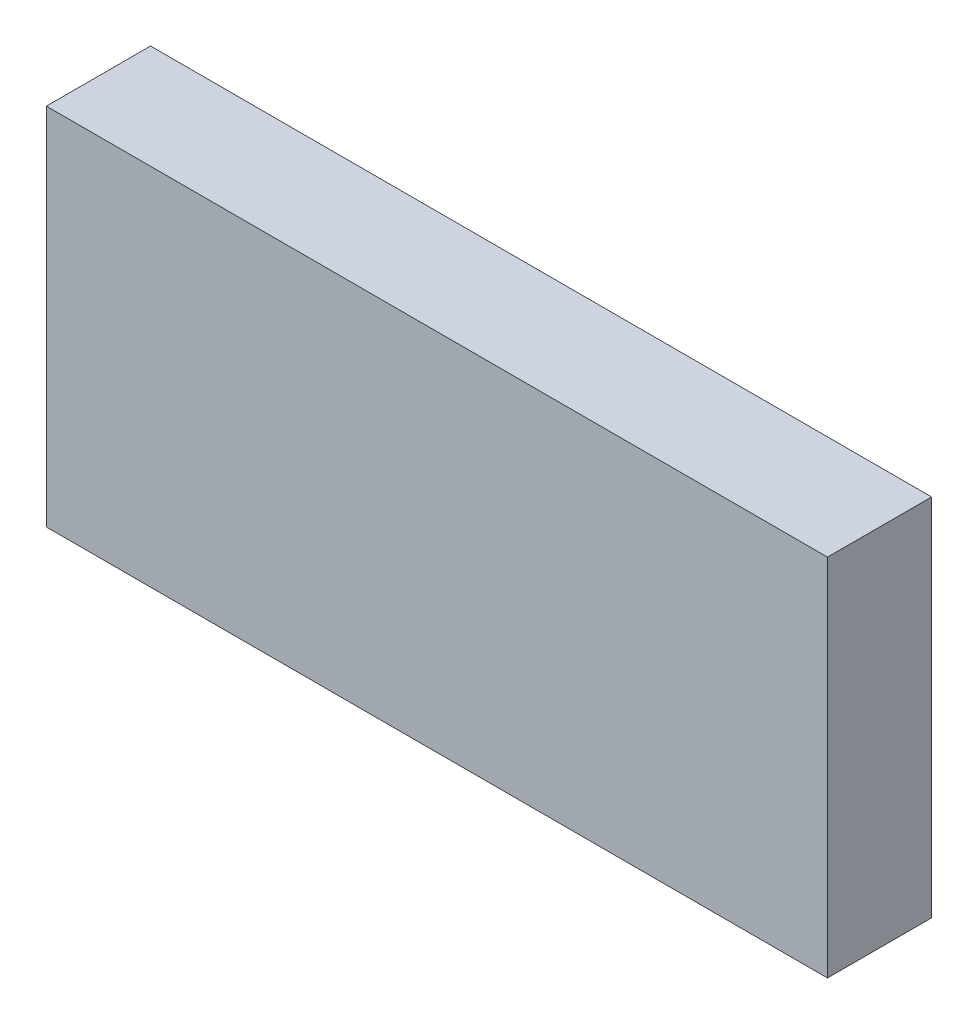
ISO-10303-21;
HEADER;
FILE_DESCRIPTION(('STEP AP214'),'2;1');
FILE_NAME('part.step','',(''),(''),'','','');
FILE_SCHEMA(('AUTOMOTIVE_DESIGN { 1 0 10303 214 1 1 1 1 }'));
ENDSEC;
DATA;
#1=APPLICATION_CONTEXT('core data for automotive mechanical design processes');
#2=APPLICATION_PROTOCOL_DEFINITION('international standard','automotive_design',2000,#1);
#3=PRODUCT_CONTEXT('',#1,'mechanical');
#4=PRODUCT('Part','Part','',(#3));
#5=PRODUCT_RELATED_PRODUCT_CATEGORY('part','',(#4));
#6=PRODUCT_DEFINITION_FORMATION('','',#4);
#7=PRODUCT_DEFINITION_CONTEXT('part definition',#1,'design');
#8=PRODUCT_DEFINITION('design','',#6,#7);
#9=PRODUCT_DEFINITION_SHAPE('','',#8);
#10=(LENGTH_UNIT() NAMED_UNIT(*) SI_UNIT(.MILLI.,.METRE.));
#11=(NAMED_UNIT(*) PLANE_ANGLE_UNIT() SI_UNIT($,.RADIAN.));
#12=(NAMED_UNIT(*) SI_UNIT($,.STERADIAN.) SOLID_ANGLE_UNIT());
#13=UNCERTAINTY_MEASURE_WITH_UNIT(LENGTH_MEASURE(1.E-05),#10,'distance_accuracy_value','');
#14=(GEOMETRIC_REPRESENTATION_CONTEXT(3) GLOBAL_UNCERTAINTY_ASSIGNED_CONTEXT((#13)) GLOBAL_UNIT_ASSIGNED_CONTEXT((#10,
#11,#12)) REPRESENTATION_CONTEXT('',''));
#15=CARTESIAN_POINT('',(0.,0.,0.));
#16=DIRECTION('',(0.,0.,1.));
#17=DIRECTION('',(1.,0.,0.));
#18=AXIS2_PLACEMENT_3D('',#15,#16,#17);
#19=CARTESIAN_POINT('',(75.,-35.,20.));
#20=DIRECTION('',(-1.,0.,0.));
#21=DIRECTION('',(0.,0.,1.));
#22=AXIS2_PLACEMENT_3D('',#19,#20,#21);
#23=PLANE('',#22);
#24=DIRECTION('',(0.,1.,0.));
#25=VECTOR('',#24,1.);
#26=CARTESIAN_POINT('',(75.,-35.,0.));
#27=LINE('',#26,#25);
#28=CARTESIAN_POINT('',(75.,-35.,0.));
#29=VERTEX_POINT('',#28);
#30=CARTESIAN_POINT('',(75.,35.,0.));
#31=VERTEX_POINT('',#30);
#32=EDGE_CURVE('E113',#29,#31,#27,.T.);
#33=ORIENTED_EDGE('',*,*,#32,.T.);
#34=DIRECTION('',(0.,0.,-1.));
#35=VECTOR('',#34,1.);
#36=CARTESIAN_POINT('',(75.,35.,20.));
#37=LINE('',#36,#35);
#38=CARTESIAN_POINT('',(75.,35.,20.));
#39=VERTEX_POINT('',#38);
#40=EDGE_CURVE('E11',#39,#31,#37,.T.);
#41=ORIENTED_EDGE('',*,*,#40,.F.);
#42=DIRECTION('',(0.,1.,0.));
#43=VECTOR('',#42,1.);
#44=CARTESIAN_POINT('',(75.,-35.,20.));
#45=LINE('',#44,#43);
#46=CARTESIAN_POINT('',(75.,-35.,20.));
#47=VERTEX_POINT('',#46);
#48=EDGE_CURVE('E97',#47,#39,#45,.T.);
#49=ORIENTED_EDGE('',*,*,#48,.F.);
#50=DIRECTION('',(0.,0.,-1.));
#51=VECTOR('',#50,1.);
#52=CARTESIAN_POINT('',(75.,-35.,20.));
#53=LINE('',#52,#51);
#54=EDGE_CURVE('E109',#47,#29,#53,.T.);
#55=ORIENTED_EDGE('',*,*,#54,.T.);
#56=EDGE_LOOP('',(#33,#41,#49,#55));
#57=FACE_BOUND('',#56,.T.);
#58=ADVANCED_FACE('F45',(#57),#23,.F.);
#59=CARTESIAN_POINT('',(-75.,35.,20.));
#60=DIRECTION('',(0.,-1.,0.));
#61=DIRECTION('',(0.,0.,-1.));
#62=AXIS2_PLACEMENT_3D('',#59,#60,#61);
#63=PLANE('',#62);
#64=DIRECTION('',(-1.,0.,0.));
#65=VECTOR('',#64,1.);
#66=CARTESIAN_POINT('',(-75.,35.,0.));
#67=LINE('',#66,#65);
#68=CARTESIAN_POINT('',(-75.,35.,0.));
#69=VERTEX_POINT('',#68);
#70=EDGE_CURVE('E102',#31,#69,#67,.T.);
#71=ORIENTED_EDGE('',*,*,#70,.T.);
#72=DIRECTION('',(0.,0.,-1.));
#73=VECTOR('',#72,1.);
#74=CARTESIAN_POINT('',(-75.,35.,20.));
#75=LINE('',#74,#73);
#76=CARTESIAN_POINT('',(-75.,35.,20.));
#77=VERTEX_POINT('',#76);
#78=EDGE_CURVE('E54',#77,#69,#75,.T.);
#79=ORIENTED_EDGE('',*,*,#78,.F.);
#80=DIRECTION('',(-1.,0.,0.));
#81=VECTOR('',#80,1.);
#82=CARTESIAN_POINT('',(-75.,35.,20.));
#83=LINE('',#82,#81);
#84=EDGE_CURVE('E92',#39,#77,#83,.T.);
#85=ORIENTED_EDGE('',*,*,#84,.F.);
#86=ORIENTED_EDGE('',*,*,#40,.T.);
#87=EDGE_LOOP('',(#71,#79,#85,#86));
#88=FACE_BOUND('',#87,.T.);
#89=ADVANCED_FACE('F101',(#88),#63,.F.);
#90=CARTESIAN_POINT('',(-75.,-35.,20.));
#91=DIRECTION('',(1.,0.,0.));
#92=DIRECTION('',(0.,0.,-1.));
#93=AXIS2_PLACEMENT_3D('',#90,#91,#92);
#94=PLANE('',#93);
#95=DIRECTION('',(0.,-1.,0.));
#96=VECTOR('',#95,1.);
#97=CARTESIAN_POINT('',(-75.,-35.,0.));
#98=LINE('',#97,#96);
#99=CARTESIAN_POINT('',(-75.,-35.,0.));
#100=VERTEX_POINT('',#99);
#101=EDGE_CURVE('E79',#69,#100,#98,.T.);
#102=ORIENTED_EDGE('',*,*,#101,.T.);
#103=DIRECTION('',(0.,0.,-1.));
#104=VECTOR('',#103,1.);
#105=CARTESIAN_POINT('',(-75.,-35.,20.));
#106=LINE('',#105,#104);
#107=CARTESIAN_POINT('',(-75.,-35.,20.));
#108=VERTEX_POINT('',#107);
#109=EDGE_CURVE('E104',#108,#100,#106,.T.);
#110=ORIENTED_EDGE('',*,*,#109,.F.);
#111=DIRECTION('',(0.,-1.,0.));
#112=VECTOR('',#111,1.);
#113=CARTESIAN_POINT('',(-75.,-35.,20.));
#114=LINE('',#113,#112);
#115=EDGE_CURVE('E95',#77,#108,#114,.T.);
#116=ORIENTED_EDGE('',*,*,#115,.F.);
#117=ORIENTED_EDGE('',*,*,#78,.T.);
#118=EDGE_LOOP('',(#102,#110,#116,#117));
#119=FACE_BOUND('',#118,.T.);
#120=ADVANCED_FACE('F105',(#119),#94,.F.);
#121=CARTESIAN_POINT('',(-75.,-35.,20.));
#122=DIRECTION('',(0.,1.,0.));
#123=DIRECTION('',(0.,0.,1.));
#124=AXIS2_PLACEMENT_3D('',#121,#122,#123);
#125=PLANE('',#124);
#126=DIRECTION('',(1.,0.,0.));
#127=VECTOR('',#126,1.);
#128=CARTESIAN_POINT('',(-75.,-35.,0.));
#129=LINE('',#128,#127);
#130=EDGE_CURVE('E85',#100,#29,#129,.T.);
#131=ORIENTED_EDGE('',*,*,#130,.T.);
#132=ORIENTED_EDGE('',*,*,#54,.F.);
#133=DIRECTION('',(1.,0.,0.));
#134=VECTOR('',#133,1.);
#135=CARTESIAN_POINT('',(-75.,-35.,20.));
#136=LINE('',#135,#134);
#137=EDGE_CURVE('E62',#108,#47,#136,.T.);
#138=ORIENTED_EDGE('',*,*,#137,.F.);
#139=ORIENTED_EDGE('',*,*,#109,.T.);
#140=EDGE_LOOP('',(#131,#132,#138,#139));
#141=FACE_BOUND('',#140,.T.);
#142=ADVANCED_FACE('F126',(#141),#125,.F.);
#143=CARTESIAN_POINT('',(0.,0.,20.));
#144=DIRECTION('',(0.,0.,-1.));
#145=DIRECTION('',(-1.,0.,0.));
#146=AXIS2_PLACEMENT_3D('',#143,#144,#145);
#147=PLANE('',#146);
#148=ORIENTED_EDGE('',*,*,#48,.T.);
#149=ORIENTED_EDGE('',*,*,#84,.T.);
#150=ORIENTED_EDGE('',*,*,#115,.T.);
#151=ORIENTED_EDGE('',*,*,#137,.T.);
#152=EDGE_LOOP('',(#148,#149,#150,#151));
#153=FACE_BOUND('',#152,.T.);
#154=ADVANCED_FACE('F93',(#153),#147,.F.);
#155=CARTESIAN_POINT('',(0.,0.,0.));
#156=DIRECTION('',(0.,0.,-1.));
#157=DIRECTION('',(-1.,0.,0.));
#158=AXIS2_PLACEMENT_3D('',#155,#156,#157);
#159=PLANE('',#158);
#160=ORIENTED_EDGE('',*,*,#32,.F.);
#161=ORIENTED_EDGE('',*,*,#130,.F.);
#162=ORIENTED_EDGE('',*,*,#101,.F.);
#163=ORIENTED_EDGE('',*,*,#70,.F.);
#164=EDGE_LOOP('',(#160,#161,#162,#163));
#165=FACE_BOUND('',#164,.T.);
#166=ADVANCED_FACE('F129',(#165),#159,.T.);
#167=CLOSED_SHELL('',(#58,#89,#120,#142,#154,#166));
#168=MANIFOLD_SOLID_BREP('B2',#167);
#169=ADVANCED_BREP_SHAPE_REPRESENTATION('',(#18,#168),#14);
#170=SHAPE_DEFINITION_REPRESENTATION(#9,#169);
ENDSEC;
END-ISO-10303-21;
